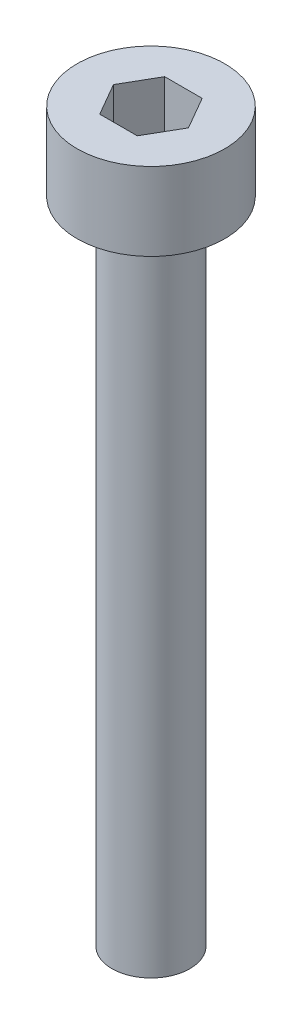
ISO-10303-21;
HEADER;
FILE_DESCRIPTION(('STEP AP214'),'2;1');
FILE_NAME('part.step','',(''),(''),'','','');
FILE_SCHEMA(('AUTOMOTIVE_DESIGN { 1 0 10303 214 1 1 1 1 }'));
ENDSEC;
DATA;
#1=APPLICATION_CONTEXT('core data for automotive mechanical design processes');
#2=APPLICATION_PROTOCOL_DEFINITION('international standard','automotive_design',2000,#1);
#3=PRODUCT_CONTEXT('',#1,'mechanical');
#4=PRODUCT('Part','Part','',(#3));
#5=PRODUCT_RELATED_PRODUCT_CATEGORY('part','',(#4));
#6=PRODUCT_DEFINITION_FORMATION('','',#4);
#7=PRODUCT_DEFINITION_CONTEXT('part definition',#1,'design');
#8=PRODUCT_DEFINITION('design','',#6,#7);
#9=PRODUCT_DEFINITION_SHAPE('','',#8);
#10=(LENGTH_UNIT() NAMED_UNIT(*) SI_UNIT(.MILLI.,.METRE.));
#11=(NAMED_UNIT(*) PLANE_ANGLE_UNIT() SI_UNIT($,.RADIAN.));
#12=(NAMED_UNIT(*) SI_UNIT($,.STERADIAN.) SOLID_ANGLE_UNIT());
#13=UNCERTAINTY_MEASURE_WITH_UNIT(LENGTH_MEASURE(1.E-05),#10,'distance_accuracy_value','');
#14=(GEOMETRIC_REPRESENTATION_CONTEXT(3) GLOBAL_UNCERTAINTY_ASSIGNED_CONTEXT((#13)) GLOBAL_UNIT_ASSIGNED_CONTEXT((#10,
#11,#12)) REPRESENTATION_CONTEXT('',''));
#15=CARTESIAN_POINT('',(0.,0.,0.));
#16=DIRECTION('',(0.,0.,1.));
#17=DIRECTION('',(1.,0.,0.));
#18=AXIS2_PLACEMENT_3D('',#15,#16,#17);
#19=CARTESIAN_POINT('',(0.,3.,0.));
#20=DIRECTION('',(0.,1.,0.));
#21=DIRECTION('',(0.,0.,1.));
#22=AXIS2_PLACEMENT_3D('',#19,#20,#21);
#23=PLANE('',#22);
#24=CARTESIAN_POINT('',(0.,3.,0.));
#25=DIRECTION('',(0.,1.,0.));
#26=DIRECTION('',(0.,0.,1.));
#27=AXIS2_PLACEMENT_3D('',#24,#25,#26);
#28=CIRCLE('',#27,2.84);
#29=CARTESIAN_POINT('',(0.,3.,2.84));
#30=VERTEX_POINT('',#29);
#31=EDGE_CURVE('E41',#30,#30,#28,.T.);
#32=ORIENTED_EDGE('',*,*,#31,.T.);
#33=EDGE_LOOP('',(#32));
#34=FACE_BOUND('',#33,.T.);
#35=DIRECTION('',(-1.,0.,0.));
#36=VECTOR('',#35,1.);
#37=CARTESIAN_POINT('',(0.721687836487032,3.,-1.25));
#38=LINE('',#37,#36);
#39=CARTESIAN_POINT('',(0.721687836487032,3.,-1.25));
#40=VERTEX_POINT('',#39);
#41=CARTESIAN_POINT('',(-0.721687836487032,3.,-1.25));
#42=VERTEX_POINT('',#41);
#43=EDGE_CURVE('E103',#40,#42,#38,.T.);
#44=ORIENTED_EDGE('',*,*,#43,.F.);
#45=DIRECTION('',(-0.5,0.,-0.866025403784438));
#46=VECTOR('',#45,1.);
#47=CARTESIAN_POINT('',(1.44337567297406,3.,0.));
#48=LINE('',#47,#46);
#49=CARTESIAN_POINT('',(1.44337567297406,3.,0.));
#50=VERTEX_POINT('',#49);
#51=EDGE_CURVE('E83',#50,#40,#48,.T.);
#52=ORIENTED_EDGE('',*,*,#51,.F.);
#53=DIRECTION('',(0.5,0.,-0.866025403784439));
#54=VECTOR('',#53,1.);
#55=CARTESIAN_POINT('',(0.721687836487032,3.,1.25));
#56=LINE('',#55,#54);
#57=CARTESIAN_POINT('',(0.721687836487032,3.,1.25));
#58=VERTEX_POINT('',#57);
#59=EDGE_CURVE('E54',#58,#50,#56,.T.);
#60=ORIENTED_EDGE('',*,*,#59,.F.);
#61=DIRECTION('',(1.,0.,0.));
#62=VECTOR('',#61,1.);
#63=CARTESIAN_POINT('',(-0.721687836487032,3.,1.25));
#64=LINE('',#63,#62);
#65=CARTESIAN_POINT('',(-0.721687836487032,3.,1.25));
#66=VERTEX_POINT('',#65);
#67=EDGE_CURVE('E114',#66,#58,#64,.T.);
#68=ORIENTED_EDGE('',*,*,#67,.F.);
#69=DIRECTION('',(0.5,0.,0.866025403784439));
#70=VECTOR('',#69,1.);
#71=CARTESIAN_POINT('',(-1.44337567297406,3.,0.));
#72=LINE('',#71,#70);
#73=CARTESIAN_POINT('',(-1.44337567297406,3.,0.));
#74=VERTEX_POINT('',#73);
#75=EDGE_CURVE('E102',#74,#66,#72,.T.);
#76=ORIENTED_EDGE('',*,*,#75,.F.);
#77=DIRECTION('',(-0.5,0.,0.866025403784439));
#78=VECTOR('',#77,1.);
#79=CARTESIAN_POINT('',(-0.721687836487032,3.,-1.25));
#80=LINE('',#79,#78);
#81=EDGE_CURVE('E92',#42,#74,#80,.T.);
#82=ORIENTED_EDGE('',*,*,#81,.F.);
#83=EDGE_LOOP('',(#44,#52,#60,#68,#76,#82));
#84=FACE_BOUND('',#83,.T.);
#85=ADVANCED_FACE('F33',(#34,#84),#23,.T.);
#86=CARTESIAN_POINT('',(0.,0.,0.));
#87=DIRECTION('',(0.,1.,0.));
#88=DIRECTION('',(0.,0.,1.));
#89=AXIS2_PLACEMENT_3D('',#86,#87,#88);
#90=PLANE('',#89);
#91=CARTESIAN_POINT('',(0.,0.,0.));
#92=DIRECTION('',(0.,1.,0.));
#93=DIRECTION('',(0.,0.,1.));
#94=AXIS2_PLACEMENT_3D('',#91,#92,#93);
#95=CIRCLE('',#94,1.5);
#96=CARTESIAN_POINT('',(0.,0.,1.5));
#97=VERTEX_POINT('',#96);
#98=EDGE_CURVE('E11',#97,#97,#95,.F.);
#99=ORIENTED_EDGE('',*,*,#98,.F.);
#100=EDGE_LOOP('',(#99));
#101=FACE_BOUND('',#100,.T.);
#102=CARTESIAN_POINT('',(0.,0.,0.));
#103=DIRECTION('',(0.,1.,0.));
#104=DIRECTION('',(0.,0.,1.));
#105=AXIS2_PLACEMENT_3D('',#102,#103,#104);
#106=CIRCLE('',#105,2.84);
#107=CARTESIAN_POINT('',(0.,0.,2.84));
#108=VERTEX_POINT('',#107);
#109=EDGE_CURVE('E143',#108,#108,#106,.T.);
#110=ORIENTED_EDGE('',*,*,#109,.F.);
#111=EDGE_LOOP('',(#110));
#112=FACE_BOUND('',#111,.T.);
#113=ADVANCED_FACE('F149',(#101,#112),#90,.F.);
#114=CARTESIAN_POINT('',(0.,3.,0.));
#115=DIRECTION('',(0.,-1.,0.));
#116=DIRECTION('',(0.,0.,-1.));
#117=AXIS2_PLACEMENT_3D('',#114,#115,#116);
#118=CYLINDRICAL_SURFACE('',#117,2.84);
#119=ORIENTED_EDGE('',*,*,#31,.F.);
#120=EDGE_LOOP('',(#119));
#121=FACE_BOUND('',#120,.T.);
#122=ORIENTED_EDGE('',*,*,#109,.T.);
#123=EDGE_LOOP('',(#122));
#124=FACE_BOUND('',#123,.T.);
#125=ADVANCED_FACE('F35',(#121,#124),#118,.T.);
#126=CARTESIAN_POINT('',(1.44337567297406,3.,0.));
#127=DIRECTION('',(-0.866025403784439,0.,0.5));
#128=DIRECTION('',(0.5,0.,0.866025403784439));
#129=AXIS2_PLACEMENT_3D('',#126,#127,#128);
#130=PLANE('',#129);
#131=DIRECTION('',(-0.5,0.,-0.866025403784438));
#132=VECTOR('',#131,1.);
#133=CARTESIAN_POINT('',(1.44337567297406,0.,0.));
#134=LINE('',#133,#132);
#135=CARTESIAN_POINT('',(1.44337567297406,0.,0.));
#136=VERTEX_POINT('',#135);
#137=CARTESIAN_POINT('',(0.721687836487032,0.,-1.25));
#138=VERTEX_POINT('',#137);
#139=EDGE_CURVE('E121',#136,#138,#134,.T.);
#140=ORIENTED_EDGE('',*,*,#139,.F.);
#141=DIRECTION('',(0.,-1.,0.));
#142=VECTOR('',#141,1.);
#143=CARTESIAN_POINT('',(1.44337567297406,3.,0.));
#144=LINE('',#143,#142);
#145=EDGE_CURVE('E120',#50,#136,#144,.T.);
#146=ORIENTED_EDGE('',*,*,#145,.F.);
#147=ORIENTED_EDGE('',*,*,#51,.T.);
#148=DIRECTION('',(0.,-1.,0.));
#149=VECTOR('',#148,1.);
#150=CARTESIAN_POINT('',(0.721687836487032,3.,-1.25));
#151=LINE('',#150,#149);
#152=EDGE_CURVE('E141',#40,#138,#151,.T.);
#153=ORIENTED_EDGE('',*,*,#152,.T.);
#154=EDGE_LOOP('',(#140,#146,#147,#153));
#155=FACE_BOUND('',#154,.T.);
#156=ADVANCED_FACE('F156',(#155),#130,.T.);
#157=CARTESIAN_POINT('',(0.721687836487032,3.,-1.25));
#158=DIRECTION('',(0.,0.,1.));
#159=DIRECTION('',(1.,0.,0.));
#160=AXIS2_PLACEMENT_3D('',#157,#158,#159);
#161=PLANE('',#160);
#162=DIRECTION('',(-1.,0.,0.));
#163=VECTOR('',#162,1.);
#164=CARTESIAN_POINT('',(0.721687836487032,0.,-1.25));
#165=LINE('',#164,#163);
#166=CARTESIAN_POINT('',(-0.721687836487032,0.,-1.25));
#167=VERTEX_POINT('',#166);
#168=EDGE_CURVE('E124',#138,#167,#165,.T.);
#169=ORIENTED_EDGE('',*,*,#168,.F.);
#170=ORIENTED_EDGE('',*,*,#152,.F.);
#171=ORIENTED_EDGE('',*,*,#43,.T.);
#172=DIRECTION('',(0.,-1.,0.));
#173=VECTOR('',#172,1.);
#174=CARTESIAN_POINT('',(-0.721687836487032,3.,-1.25));
#175=LINE('',#174,#173);
#176=EDGE_CURVE('E98',#42,#167,#175,.T.);
#177=ORIENTED_EDGE('',*,*,#176,.T.);
#178=EDGE_LOOP('',(#169,#170,#171,#177));
#179=FACE_BOUND('',#178,.T.);
#180=ADVANCED_FACE('F164',(#179),#161,.T.);
#181=CARTESIAN_POINT('',(-0.721687836487032,3.,-1.25));
#182=DIRECTION('',(0.866025403784439,0.,0.5));
#183=DIRECTION('',(0.5,0.,-0.866025403784439));
#184=AXIS2_PLACEMENT_3D('',#181,#182,#183);
#185=PLANE('',#184);
#186=DIRECTION('',(-0.5,0.,0.866025403784439));
#187=VECTOR('',#186,1.);
#188=CARTESIAN_POINT('',(-0.721687836487032,0.,-1.25));
#189=LINE('',#188,#187);
#190=CARTESIAN_POINT('',(-1.44337567297406,0.,0.));
#191=VERTEX_POINT('',#190);
#192=EDGE_CURVE('E128',#167,#191,#189,.T.);
#193=ORIENTED_EDGE('',*,*,#192,.F.);
#194=ORIENTED_EDGE('',*,*,#176,.F.);
#195=ORIENTED_EDGE('',*,*,#81,.T.);
#196=DIRECTION('',(0.,-1.,0.));
#197=VECTOR('',#196,1.);
#198=CARTESIAN_POINT('',(-1.44337567297406,3.,0.));
#199=LINE('',#198,#197);
#200=EDGE_CURVE('E96',#74,#191,#199,.T.);
#201=ORIENTED_EDGE('',*,*,#200,.T.);
#202=EDGE_LOOP('',(#193,#194,#195,#201));
#203=FACE_BOUND('',#202,.T.);
#204=ADVANCED_FACE('F95',(#203),#185,.T.);
#205=CARTESIAN_POINT('',(-1.44337567297406,3.,0.));
#206=DIRECTION('',(0.866025403784439,0.,-0.5));
#207=DIRECTION('',(-0.5,0.,-0.866025403784439));
#208=AXIS2_PLACEMENT_3D('',#205,#206,#207);
#209=PLANE('',#208);
#210=DIRECTION('',(0.5,0.,0.866025403784439));
#211=VECTOR('',#210,1.);
#212=CARTESIAN_POINT('',(-1.44337567297406,0.,0.));
#213=LINE('',#212,#211);
#214=CARTESIAN_POINT('',(-0.721687836487032,0.,1.25));
#215=VERTEX_POINT('',#214);
#216=EDGE_CURVE('E109',#191,#215,#213,.T.);
#217=ORIENTED_EDGE('',*,*,#216,.F.);
#218=ORIENTED_EDGE('',*,*,#200,.F.);
#219=ORIENTED_EDGE('',*,*,#75,.T.);
#220=DIRECTION('',(0.,-1.,0.));
#221=VECTOR('',#220,1.);
#222=CARTESIAN_POINT('',(-0.721687836487032,3.,1.25));
#223=LINE('',#222,#221);
#224=EDGE_CURVE('E111',#66,#215,#223,.T.);
#225=ORIENTED_EDGE('',*,*,#224,.T.);
#226=EDGE_LOOP('',(#217,#218,#219,#225));
#227=FACE_BOUND('',#226,.T.);
#228=ADVANCED_FACE('F106',(#227),#209,.T.);
#229=CARTESIAN_POINT('',(-0.721687836487032,3.,1.25));
#230=DIRECTION('',(0.,0.,-1.));
#231=DIRECTION('',(-1.,0.,0.));
#232=AXIS2_PLACEMENT_3D('',#229,#230,#231);
#233=PLANE('',#232);
#234=DIRECTION('',(1.,0.,0.));
#235=VECTOR('',#234,1.);
#236=CARTESIAN_POINT('',(-0.721687836487032,0.,1.25));
#237=LINE('',#236,#235);
#238=CARTESIAN_POINT('',(0.721687836487032,0.,1.25));
#239=VERTEX_POINT('',#238);
#240=EDGE_CURVE('E131',#215,#239,#237,.T.);
#241=ORIENTED_EDGE('',*,*,#240,.F.);
#242=ORIENTED_EDGE('',*,*,#224,.F.);
#243=ORIENTED_EDGE('',*,*,#67,.T.);
#244=DIRECTION('',(0.,-1.,0.));
#245=VECTOR('',#244,1.);
#246=CARTESIAN_POINT('',(0.721687836487032,3.,1.25));
#247=LINE('',#246,#245);
#248=EDGE_CURVE('E48',#58,#239,#247,.T.);
#249=ORIENTED_EDGE('',*,*,#248,.T.);
#250=EDGE_LOOP('',(#241,#242,#243,#249));
#251=FACE_BOUND('',#250,.T.);
#252=ADVANCED_FACE('F172',(#251),#233,.T.);
#253=CARTESIAN_POINT('',(0.721687836487032,3.,1.25));
#254=DIRECTION('',(-0.866025403784439,0.,-0.5));
#255=DIRECTION('',(-0.5,0.,0.866025403784439));
#256=AXIS2_PLACEMENT_3D('',#253,#254,#255);
#257=PLANE('',#256);
#258=DIRECTION('',(0.5,0.,-0.866025403784439));
#259=VECTOR('',#258,1.);
#260=CARTESIAN_POINT('',(0.721687836487032,0.,1.25));
#261=LINE('',#260,#259);
#262=EDGE_CURVE('E134',#239,#136,#261,.T.);
#263=ORIENTED_EDGE('',*,*,#262,.F.);
#264=ORIENTED_EDGE('',*,*,#248,.F.);
#265=ORIENTED_EDGE('',*,*,#59,.T.);
#266=ORIENTED_EDGE('',*,*,#145,.T.);
#267=EDGE_LOOP('',(#263,#264,#265,#266));
#268=FACE_BOUND('',#267,.T.);
#269=ADVANCED_FACE('F175',(#268),#257,.T.);
#270=CARTESIAN_POINT('',(0.,0.,0.));
#271=DIRECTION('',(0.,-1.,0.));
#272=DIRECTION('',(0.,0.,-1.));
#273=AXIS2_PLACEMENT_3D('',#270,#271,#272);
#274=PLANE('',#273);
#275=ORIENTED_EDGE('',*,*,#139,.T.);
#276=ORIENTED_EDGE('',*,*,#168,.T.);
#277=ORIENTED_EDGE('',*,*,#192,.T.);
#278=ORIENTED_EDGE('',*,*,#216,.T.);
#279=ORIENTED_EDGE('',*,*,#240,.T.);
#280=ORIENTED_EDGE('',*,*,#262,.T.);
#281=EDGE_LOOP('',(#275,#276,#277,#278,#279,#280));
#282=FACE_BOUND('',#281,.T.);
#283=ADVANCED_FACE('F178',(#282),#274,.F.);
#284=CARTESIAN_POINT('',(0.,-25.,0.));
#285=DIRECTION('',(0.,1.,0.));
#286=DIRECTION('',(0.,0.,1.));
#287=AXIS2_PLACEMENT_3D('',#284,#285,#286);
#288=CYLINDRICAL_SURFACE('',#287,1.5);
#289=CARTESIAN_POINT('',(0.,-25.,0.));
#290=DIRECTION('',(0.,-1.,0.));
#291=DIRECTION('',(0.,0.,-1.));
#292=AXIS2_PLACEMENT_3D('',#289,#290,#291);
#293=CIRCLE('',#292,1.5);
#294=CARTESIAN_POINT('',(0.,-25.,-1.5));
#295=VERTEX_POINT('',#294);
#296=EDGE_CURVE('E125',#295,#295,#293,.T.);
#297=ORIENTED_EDGE('',*,*,#296,.F.);
#298=EDGE_LOOP('',(#297));
#299=FACE_BOUND('',#298,.T.);
#300=ORIENTED_EDGE('',*,*,#98,.T.);
#301=EDGE_LOOP('',(#300));
#302=FACE_BOUND('',#301,.T.);
#303=ADVANCED_FACE('F179',(#299,#302),#288,.T.);
#304=CARTESIAN_POINT('',(0.,-25.,0.));
#305=DIRECTION('',(0.,-1.,0.));
#306=DIRECTION('',(0.,0.,-1.));
#307=AXIS2_PLACEMENT_3D('',#304,#305,#306);
#308=PLANE('',#307);
#309=ORIENTED_EDGE('',*,*,#296,.T.);
#310=EDGE_LOOP('',(#309));
#311=FACE_BOUND('',#310,.T.);
#312=ADVANCED_FACE('F182',(#311),#308,.T.);
#313=CLOSED_SHELL('',(#85,#113,#125,#156,#180,#204,#228,#252,#269,#283,#303,#312));
#314=MANIFOLD_SOLID_BREP('B2',#313);
#315=ADVANCED_BREP_SHAPE_REPRESENTATION('',(#18,#314),#14);
#316=SHAPE_DEFINITION_REPRESENTATION(#9,#315);
ENDSEC;
END-ISO-10303-21;
